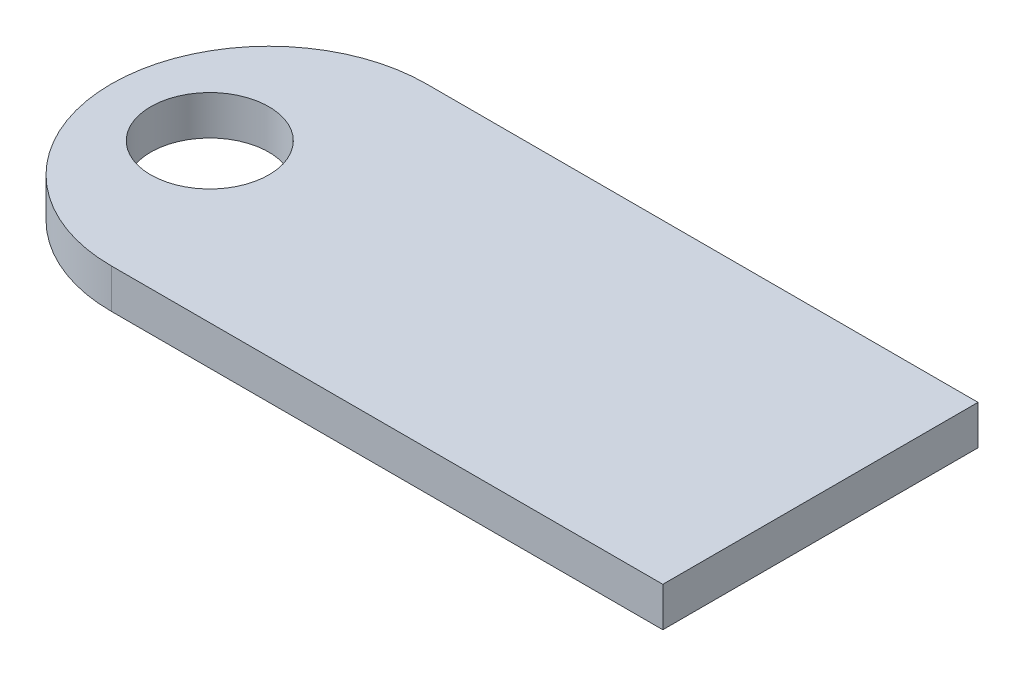
ISO-10303-21;
HEADER;
FILE_DESCRIPTION(('STEP AP214'),'2;1');
FILE_NAME('part.step','',(''),(''),'','','');
FILE_SCHEMA(('AUTOMOTIVE_DESIGN { 1 0 10303 214 1 1 1 1 }'));
ENDSEC;
DATA;
#1=APPLICATION_CONTEXT('core data for automotive mechanical design processes');
#2=APPLICATION_PROTOCOL_DEFINITION('international standard','automotive_design',2000,#1);
#3=PRODUCT_CONTEXT('',#1,'mechanical');
#4=PRODUCT('Part','Part','',(#3));
#5=PRODUCT_RELATED_PRODUCT_CATEGORY('part','',(#4));
#6=PRODUCT_DEFINITION_FORMATION('','',#4);
#7=PRODUCT_DEFINITION_CONTEXT('part definition',#1,'design');
#8=PRODUCT_DEFINITION('design','',#6,#7);
#9=PRODUCT_DEFINITION_SHAPE('','',#8);
#10=(LENGTH_UNIT() NAMED_UNIT(*) SI_UNIT(.MILLI.,.METRE.));
#11=(NAMED_UNIT(*) PLANE_ANGLE_UNIT() SI_UNIT($,.RADIAN.));
#12=(NAMED_UNIT(*) SI_UNIT($,.STERADIAN.) SOLID_ANGLE_UNIT());
#13=UNCERTAINTY_MEASURE_WITH_UNIT(LENGTH_MEASURE(1.E-05),#10,'distance_accuracy_value','');
#14=(GEOMETRIC_REPRESENTATION_CONTEXT(3) GLOBAL_UNCERTAINTY_ASSIGNED_CONTEXT((#13)) GLOBAL_UNIT_ASSIGNED_CONTEXT((#10,
#11,#12)) REPRESENTATION_CONTEXT('',''));
#15=CARTESIAN_POINT('',(0.,0.,0.));
#16=DIRECTION('',(0.,0.,1.));
#17=DIRECTION('',(1.,0.,0.));
#18=AXIS2_PLACEMENT_3D('',#15,#16,#17);
#19=CARTESIAN_POINT('',(0.,6.35,0.));
#20=DIRECTION('',(0.,1.,0.));
#21=DIRECTION('',(0.,0.,1.));
#22=AXIS2_PLACEMENT_3D('',#19,#20,#21);
#23=PLANE('',#22);
#24=CARTESIAN_POINT('',(15.875,6.35,0.));
#25=DIRECTION('',(0.,1.,0.));
#26=DIRECTION('',(0.,0.,1.));
#27=AXIS2_PLACEMENT_3D('',#24,#25,#26);
#28=CIRCLE('',#27,9.525);
#29=CARTESIAN_POINT('',(15.875,6.35,9.525));
#30=VERTEX_POINT('',#29);
#31=EDGE_CURVE('E81',#30,#30,#28,.F.);
#32=ORIENTED_EDGE('',*,*,#31,.T.);
#33=EDGE_LOOP('',(#32));
#34=FACE_BOUND('',#33,.T.);
#35=DIRECTION('',(0.,0.,-1.));
#36=VECTOR('',#35,1.);
#37=CARTESIAN_POINT('',(114.3,6.35,25.4));
#38=LINE('',#37,#36);
#39=CARTESIAN_POINT('',(114.3,6.35,-25.4));
#40=VERTEX_POINT('',#39);
#41=CARTESIAN_POINT('',(114.3,6.35,25.4));
#42=VERTEX_POINT('',#41);
#43=EDGE_CURVE('E69',#40,#42,#38,.F.);
#44=ORIENTED_EDGE('',*,*,#43,.F.);
#45=DIRECTION('',(-1.,0.,0.));
#46=VECTOR('',#45,1.);
#47=CARTESIAN_POINT('',(114.3,6.35,-25.4));
#48=LINE('',#47,#46);
#49=CARTESIAN_POINT('',(25.4,6.35,-25.4));
#50=VERTEX_POINT('',#49);
#51=EDGE_CURVE('E57',#50,#40,#48,.F.);
#52=ORIENTED_EDGE('',*,*,#51,.F.);
#53=CARTESIAN_POINT('',(25.4,6.35,0.));
#54=DIRECTION('',(0.,-1.,0.));
#55=DIRECTION('',(0.,0.,-1.));
#56=AXIS2_PLACEMENT_3D('',#53,#54,#55);
#57=CIRCLE('',#56,25.4);
#58=CARTESIAN_POINT('',(25.4,6.35,25.4));
#59=VERTEX_POINT('',#58);
#60=EDGE_CURVE('E19',#59,#50,#57,.T.);
#61=ORIENTED_EDGE('',*,*,#60,.F.);
#62=DIRECTION('',(1.,0.,0.));
#63=VECTOR('',#62,1.);
#64=CARTESIAN_POINT('',(0.,6.35,25.4));
#65=LINE('',#64,#63);
#66=EDGE_CURVE('E52',#42,#59,#65,.F.);
#67=ORIENTED_EDGE('',*,*,#66,.F.);
#68=EDGE_LOOP('',(#44,#52,#61,#67));
#69=FACE_BOUND('',#68,.T.);
#70=ADVANCED_FACE('F16',(#34,#69),#23,.T.);
#71=CARTESIAN_POINT('',(0.,0.,25.4));
#72=DIRECTION('',(0.,0.,1.));
#73=DIRECTION('',(1.,0.,0.));
#74=AXIS2_PLACEMENT_3D('',#71,#72,#73);
#75=PLANE('',#74);
#76=DIRECTION('',(0.,1.,0.));
#77=VECTOR('',#76,1.);
#78=CARTESIAN_POINT('',(114.3,0.,25.4));
#79=LINE('',#78,#77);
#80=CARTESIAN_POINT('',(114.3,0.,25.4));
#81=VERTEX_POINT('',#80);
#82=EDGE_CURVE('E64',#42,#81,#79,.F.);
#83=ORIENTED_EDGE('',*,*,#82,.F.);
#84=ORIENTED_EDGE('',*,*,#66,.T.);
#85=DIRECTION('',(0.,-1.,0.));
#86=VECTOR('',#85,1.);
#87=CARTESIAN_POINT('',(25.4,37.53358,25.4));
#88=LINE('',#87,#86);
#89=CARTESIAN_POINT('',(25.4,0.,25.4));
#90=VERTEX_POINT('',#89);
#91=EDGE_CURVE('E80',#90,#59,#88,.F.);
#92=ORIENTED_EDGE('',*,*,#91,.F.);
#93=DIRECTION('',(1.,0.,0.));
#94=VECTOR('',#93,1.);
#95=CARTESIAN_POINT('',(0.,0.,25.4));
#96=LINE('',#95,#94);
#97=EDGE_CURVE('E75',#90,#81,#96,.T.);
#98=ORIENTED_EDGE('',*,*,#97,.T.);
#99=EDGE_LOOP('',(#83,#84,#92,#98));
#100=FACE_BOUND('',#99,.T.);
#101=ADVANCED_FACE('F79',(#100),#75,.T.);
#102=CARTESIAN_POINT('',(114.3,0.,25.4));
#103=DIRECTION('',(1.,0.,0.));
#104=DIRECTION('',(0.,0.,-1.));
#105=AXIS2_PLACEMENT_3D('',#102,#103,#104);
#106=PLANE('',#105);
#107=ORIENTED_EDGE('',*,*,#43,.T.);
#108=ORIENTED_EDGE('',*,*,#82,.T.);
#109=DIRECTION('',(0.,0.,1.));
#110=VECTOR('',#109,1.);
#111=CARTESIAN_POINT('',(114.3,0.,0.));
#112=LINE('',#111,#110);
#113=CARTESIAN_POINT('',(114.3,0.,-25.4));
#114=VERTEX_POINT('',#113);
#115=EDGE_CURVE('E68',#81,#114,#112,.F.);
#116=ORIENTED_EDGE('',*,*,#115,.T.);
#117=DIRECTION('',(0.,1.,0.));
#118=VECTOR('',#117,1.);
#119=CARTESIAN_POINT('',(114.3,0.,-25.4));
#120=LINE('',#119,#118);
#121=EDGE_CURVE('E92',#40,#114,#120,.F.);
#122=ORIENTED_EDGE('',*,*,#121,.F.);
#123=EDGE_LOOP('',(#107,#108,#116,#122));
#124=FACE_BOUND('',#123,.T.);
#125=ADVANCED_FACE('F66',(#124),#106,.T.);
#126=CARTESIAN_POINT('',(114.3,0.,-25.4));
#127=DIRECTION('',(0.,0.,-1.));
#128=DIRECTION('',(-1.,0.,0.));
#129=AXIS2_PLACEMENT_3D('',#126,#127,#128);
#130=PLANE('',#129);
#131=ORIENTED_EDGE('',*,*,#121,.T.);
#132=DIRECTION('',(1.,0.,0.));
#133=VECTOR('',#132,1.);
#134=CARTESIAN_POINT('',(0.,0.,-25.4));
#135=LINE('',#134,#133);
#136=CARTESIAN_POINT('',(25.4,0.,-25.4));
#137=VERTEX_POINT('',#136);
#138=EDGE_CURVE('E77',#114,#137,#135,.F.);
#139=ORIENTED_EDGE('',*,*,#138,.T.);
#140=DIRECTION('',(0.,-1.,0.));
#141=VECTOR('',#140,1.);
#142=CARTESIAN_POINT('',(25.4,37.53358,-25.4));
#143=LINE('',#142,#141);
#144=EDGE_CURVE('E34',#50,#137,#143,.T.);
#145=ORIENTED_EDGE('',*,*,#144,.F.);
#146=ORIENTED_EDGE('',*,*,#51,.T.);
#147=EDGE_LOOP('',(#131,#139,#145,#146));
#148=FACE_BOUND('',#147,.T.);
#149=ADVANCED_FACE('F109',(#148),#130,.T.);
#150=CARTESIAN_POINT('',(25.4,37.53358,0.));
#151=DIRECTION('',(0.,-1.,0.));
#152=DIRECTION('',(0.,0.,-1.));
#153=AXIS2_PLACEMENT_3D('',#150,#151,#152);
#154=CYLINDRICAL_SURFACE('',#153,25.4);
#155=ORIENTED_EDGE('',*,*,#60,.T.);
#156=ORIENTED_EDGE('',*,*,#144,.T.);
#157=CARTESIAN_POINT('',(25.4,0.,0.));
#158=DIRECTION('',(0.,-1.,0.));
#159=DIRECTION('',(0.,0.,-1.));
#160=AXIS2_PLACEMENT_3D('',#157,#158,#159);
#161=CIRCLE('',#160,25.4);
#162=EDGE_CURVE('E25',#137,#90,#161,.F.);
#163=ORIENTED_EDGE('',*,*,#162,.T.);
#164=ORIENTED_EDGE('',*,*,#91,.T.);
#165=EDGE_LOOP('',(#155,#156,#163,#164));
#166=FACE_BOUND('',#165,.T.);
#167=ADVANCED_FACE('F111',(#166),#154,.T.);
#168=CARTESIAN_POINT('',(15.875,0.,0.));
#169=DIRECTION('',(0.,1.,0.));
#170=DIRECTION('',(0.,0.,1.));
#171=AXIS2_PLACEMENT_3D('',#168,#169,#170);
#172=CYLINDRICAL_SURFACE('',#171,9.525);
#173=ORIENTED_EDGE('',*,*,#31,.F.);
#174=EDGE_LOOP('',(#173));
#175=FACE_BOUND('',#174,.T.);
#176=CARTESIAN_POINT('',(15.875,0.,0.));
#177=DIRECTION('',(0.,1.,0.));
#178=DIRECTION('',(0.,0.,1.));
#179=AXIS2_PLACEMENT_3D('',#176,#177,#178);
#180=CIRCLE('',#179,9.525);
#181=CARTESIAN_POINT('',(15.875,0.,9.525));
#182=VERTEX_POINT('',#181);
#183=EDGE_CURVE('E11',#182,#182,#180,.F.);
#184=ORIENTED_EDGE('',*,*,#183,.T.);
#185=EDGE_LOOP('',(#184));
#186=FACE_BOUND('',#185,.T.);
#187=ADVANCED_FACE('F118',(#175,#186),#172,.F.);
#188=CARTESIAN_POINT('',(0.,0.,0.));
#189=DIRECTION('',(0.,1.,0.));
#190=DIRECTION('',(0.,0.,1.));
#191=AXIS2_PLACEMENT_3D('',#188,#189,#190);
#192=PLANE('',#191);
#193=ORIENTED_EDGE('',*,*,#183,.F.);
#194=EDGE_LOOP('',(#193));
#195=FACE_BOUND('',#194,.T.);
#196=ORIENTED_EDGE('',*,*,#138,.F.);
#197=ORIENTED_EDGE('',*,*,#115,.F.);
#198=ORIENTED_EDGE('',*,*,#97,.F.);
#199=ORIENTED_EDGE('',*,*,#162,.F.);
#200=EDGE_LOOP('',(#196,#197,#198,#199));
#201=FACE_BOUND('',#200,.T.);
#202=ADVANCED_FACE('F74',(#195,#201),#192,.F.);
#203=CLOSED_SHELL('',(#70,#101,#125,#149,#167,#187,#202));
#204=MANIFOLD_SOLID_BREP('B1',#203);
#205=ADVANCED_BREP_SHAPE_REPRESENTATION('',(#18,#204),#14);
#206=SHAPE_DEFINITION_REPRESENTATION(#9,#205);
ENDSEC;
END-ISO-10303-21;
